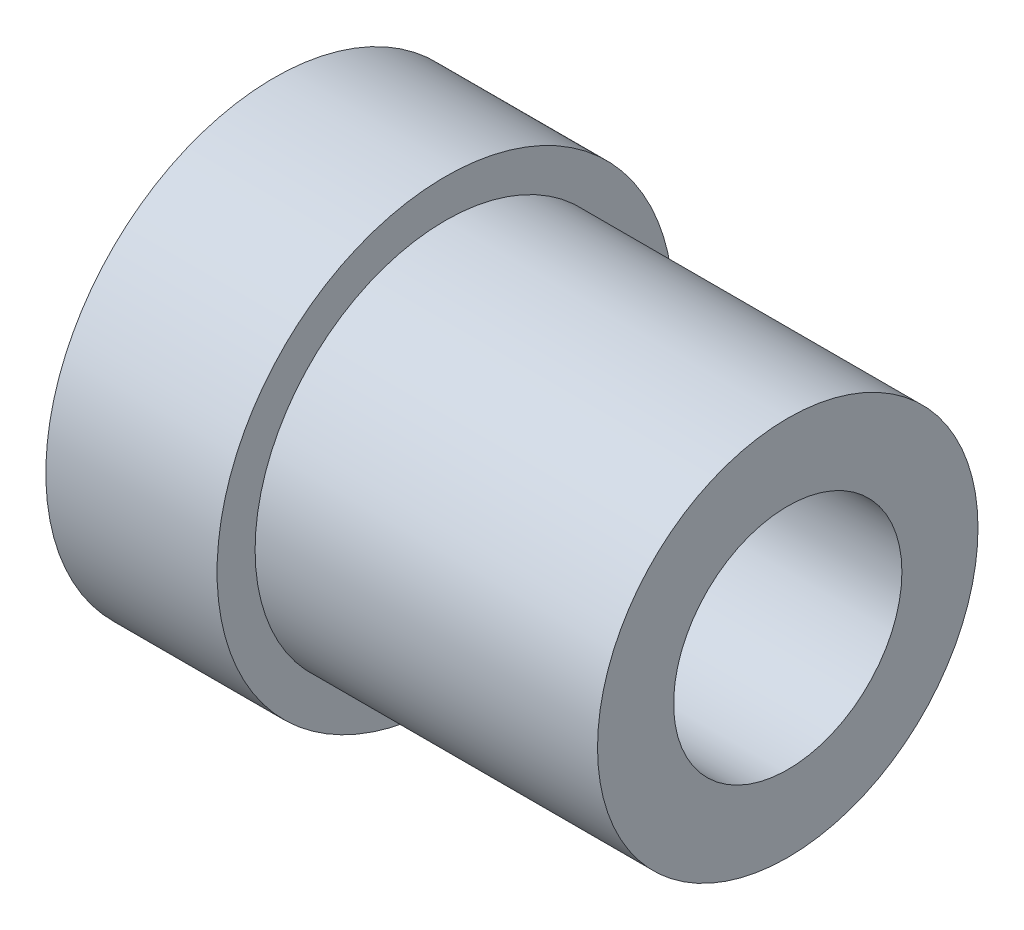
ISO-10303-21;
HEADER;
FILE_DESCRIPTION(('STEP AP214'),'2;1');
FILE_NAME('part.step','',(''),(''),'','','');
FILE_SCHEMA(('AUTOMOTIVE_DESIGN { 1 0 10303 214 1 1 1 1 }'));
ENDSEC;
DATA;
#1=APPLICATION_CONTEXT('core data for automotive mechanical design processes');
#2=APPLICATION_PROTOCOL_DEFINITION('international standard','automotive_design',2000,#1);
#3=PRODUCT_CONTEXT('',#1,'mechanical');
#4=PRODUCT('Part','Part','',(#3));
#5=PRODUCT_RELATED_PRODUCT_CATEGORY('part','',(#4));
#6=PRODUCT_DEFINITION_FORMATION('','',#4);
#7=PRODUCT_DEFINITION_CONTEXT('part definition',#1,'design');
#8=PRODUCT_DEFINITION('design','',#6,#7);
#9=PRODUCT_DEFINITION_SHAPE('','',#8);
#10=(LENGTH_UNIT() NAMED_UNIT(*) SI_UNIT(.MILLI.,.METRE.));
#11=(NAMED_UNIT(*) PLANE_ANGLE_UNIT() SI_UNIT($,.RADIAN.));
#12=(NAMED_UNIT(*) SI_UNIT($,.STERADIAN.) SOLID_ANGLE_UNIT());
#13=UNCERTAINTY_MEASURE_WITH_UNIT(LENGTH_MEASURE(1.E-05),#10,'distance_accuracy_value','');
#14=(GEOMETRIC_REPRESENTATION_CONTEXT(3) GLOBAL_UNCERTAINTY_ASSIGNED_CONTEXT((#13)) GLOBAL_UNIT_ASSIGNED_CONTEXT((#10,
#11,#12)) REPRESENTATION_CONTEXT('',''));
#15=CARTESIAN_POINT('',(0.,0.,0.));
#16=DIRECTION('',(0.,0.,1.));
#17=DIRECTION('',(1.,0.,0.));
#18=AXIS2_PLACEMENT_3D('',#15,#16,#17);
#19=CARTESIAN_POINT('',(4.5,0.,0.));
#20=DIRECTION('',(1.,0.,0.));
#21=DIRECTION('',(0.,0.,-1.));
#22=AXIS2_PLACEMENT_3D('',#19,#20,#21);
#23=PLANE('',#22);
#24=CARTESIAN_POINT('',(4.5,0.,0.));
#25=DIRECTION('',(1.,0.,0.));
#26=DIRECTION('',(0.,0.,-1.));
#27=AXIS2_PLACEMENT_3D('',#24,#25,#26);
#28=CIRCLE('',#27,6.);
#29=CARTESIAN_POINT('',(4.5,0.,-6.));
#30=VERTEX_POINT('',#29);
#31=EDGE_CURVE('E10',#30,#30,#28,.T.);
#32=ORIENTED_EDGE('',*,*,#31,.T.);
#33=EDGE_LOOP('',(#32));
#34=FACE_BOUND('',#33,.T.);
#35=CARTESIAN_POINT('',(4.5,0.,0.));
#36=DIRECTION('',(1.,0.,0.));
#37=DIRECTION('',(0.,0.,-1.));
#38=AXIS2_PLACEMENT_3D('',#35,#36,#37);
#39=CIRCLE('',#38,5.);
#40=CARTESIAN_POINT('',(4.5,0.,-5.));
#41=VERTEX_POINT('',#40);
#42=EDGE_CURVE('E47',#41,#41,#39,.T.);
#43=ORIENTED_EDGE('',*,*,#42,.F.);
#44=EDGE_LOOP('',(#43));
#45=FACE_BOUND('',#44,.T.);
#46=ADVANCED_FACE('F31',(#34,#45),#23,.T.);
#47=CARTESIAN_POINT('',(0.,0.,0.));
#48=DIRECTION('',(1.,0.,0.));
#49=DIRECTION('',(0.,0.,-1.));
#50=AXIS2_PLACEMENT_3D('',#47,#48,#49);
#51=PLANE('',#50);
#52=CARTESIAN_POINT('',(0.,0.,0.));
#53=DIRECTION('',(1.,0.,0.));
#54=DIRECTION('',(0.,0.,-1.));
#55=AXIS2_PLACEMENT_3D('',#52,#53,#54);
#56=CIRCLE('',#55,6.);
#57=CARTESIAN_POINT('',(0.,0.,-6.));
#58=VERTEX_POINT('',#57);
#59=EDGE_CURVE('E35',#58,#58,#56,.T.);
#60=ORIENTED_EDGE('',*,*,#59,.F.);
#61=EDGE_LOOP('',(#60));
#62=FACE_BOUND('',#61,.T.);
#63=CARTESIAN_POINT('',(0.,0.,0.));
#64=DIRECTION('',(1.,0.,0.));
#65=DIRECTION('',(0.,0.,-1.));
#66=AXIS2_PLACEMENT_3D('',#63,#64,#65);
#67=CIRCLE('',#66,3.);
#68=CARTESIAN_POINT('',(0.,0.,-3.));
#69=VERTEX_POINT('',#68);
#70=EDGE_CURVE('E42',#69,#69,#67,.T.);
#71=ORIENTED_EDGE('',*,*,#70,.T.);
#72=EDGE_LOOP('',(#71));
#73=FACE_BOUND('',#72,.T.);
#74=ADVANCED_FACE('F72',(#62,#73),#51,.F.);
#75=CARTESIAN_POINT('',(4.5,0.,0.));
#76=DIRECTION('',(-1.,0.,0.));
#77=DIRECTION('',(0.,0.,1.));
#78=AXIS2_PLACEMENT_3D('',#75,#76,#77);
#79=CYLINDRICAL_SURFACE('',#78,6.);
#80=ORIENTED_EDGE('',*,*,#31,.F.);
#81=EDGE_LOOP('',(#80));
#82=FACE_BOUND('',#81,.T.);
#83=ORIENTED_EDGE('',*,*,#59,.T.);
#84=EDGE_LOOP('',(#83));
#85=FACE_BOUND('',#84,.T.);
#86=ADVANCED_FACE('F33',(#82,#85),#79,.T.);
#87=CARTESIAN_POINT('',(4.5,0.,0.));
#88=DIRECTION('',(-1.,0.,0.));
#89=DIRECTION('',(0.,0.,1.));
#90=AXIS2_PLACEMENT_3D('',#87,#88,#89);
#91=CYLINDRICAL_SURFACE('',#90,3.);
#92=ORIENTED_EDGE('',*,*,#70,.F.);
#93=EDGE_LOOP('',(#92));
#94=FACE_BOUND('',#93,.T.);
#95=CARTESIAN_POINT('',(13.5,0.,0.));
#96=DIRECTION('',(1.,0.,0.));
#97=DIRECTION('',(0.,0.,-1.));
#98=AXIS2_PLACEMENT_3D('',#95,#96,#97);
#99=CIRCLE('',#98,3.);
#100=CARTESIAN_POINT('',(13.5,0.,-3.));
#101=VERTEX_POINT('',#100);
#102=EDGE_CURVE('E50',#101,#101,#99,.T.);
#103=ORIENTED_EDGE('',*,*,#102,.T.);
#104=EDGE_LOOP('',(#103));
#105=FACE_BOUND('',#104,.T.);
#106=ADVANCED_FACE('F56',(#94,#105),#91,.F.);
#107=CARTESIAN_POINT('',(13.5,0.,0.));
#108=DIRECTION('',(1.,0.,0.));
#109=DIRECTION('',(0.,0.,-1.));
#110=AXIS2_PLACEMENT_3D('',#107,#108,#109);
#111=PLANE('',#110);
#112=CARTESIAN_POINT('',(13.5,0.,0.));
#113=DIRECTION('',(1.,0.,0.));
#114=DIRECTION('',(0.,0.,-1.));
#115=AXIS2_PLACEMENT_3D('',#112,#113,#114);
#116=CIRCLE('',#115,5.);
#117=CARTESIAN_POINT('',(13.5,0.,-5.));
#118=VERTEX_POINT('',#117);
#119=EDGE_CURVE('E46',#118,#118,#116,.T.);
#120=ORIENTED_EDGE('',*,*,#119,.T.);
#121=EDGE_LOOP('',(#120));
#122=FACE_BOUND('',#121,.T.);
#123=ORIENTED_EDGE('',*,*,#102,.F.);
#124=EDGE_LOOP('',(#123));
#125=FACE_BOUND('',#124,.T.);
#126=ADVANCED_FACE('F58',(#122,#125),#111,.T.);
#127=CARTESIAN_POINT('',(13.5,0.,0.));
#128=DIRECTION('',(-1.,0.,0.));
#129=DIRECTION('',(0.,0.,1.));
#130=AXIS2_PLACEMENT_3D('',#127,#128,#129);
#131=CYLINDRICAL_SURFACE('',#130,5.);
#132=ORIENTED_EDGE('',*,*,#119,.F.);
#133=EDGE_LOOP('',(#132));
#134=FACE_BOUND('',#133,.T.);
#135=ORIENTED_EDGE('',*,*,#42,.T.);
#136=EDGE_LOOP('',(#135));
#137=FACE_BOUND('',#136,.T.);
#138=ADVANCED_FACE('F60',(#134,#137),#131,.T.);
#139=CLOSED_SHELL('',(#46,#74,#86,#106,#126,#138));
#140=MANIFOLD_SOLID_BREP('B2',#139);
#141=ADVANCED_BREP_SHAPE_REPRESENTATION('',(#18,#140),#14);
#142=SHAPE_DEFINITION_REPRESENTATION(#9,#141);
ENDSEC;
END-ISO-10303-21;
